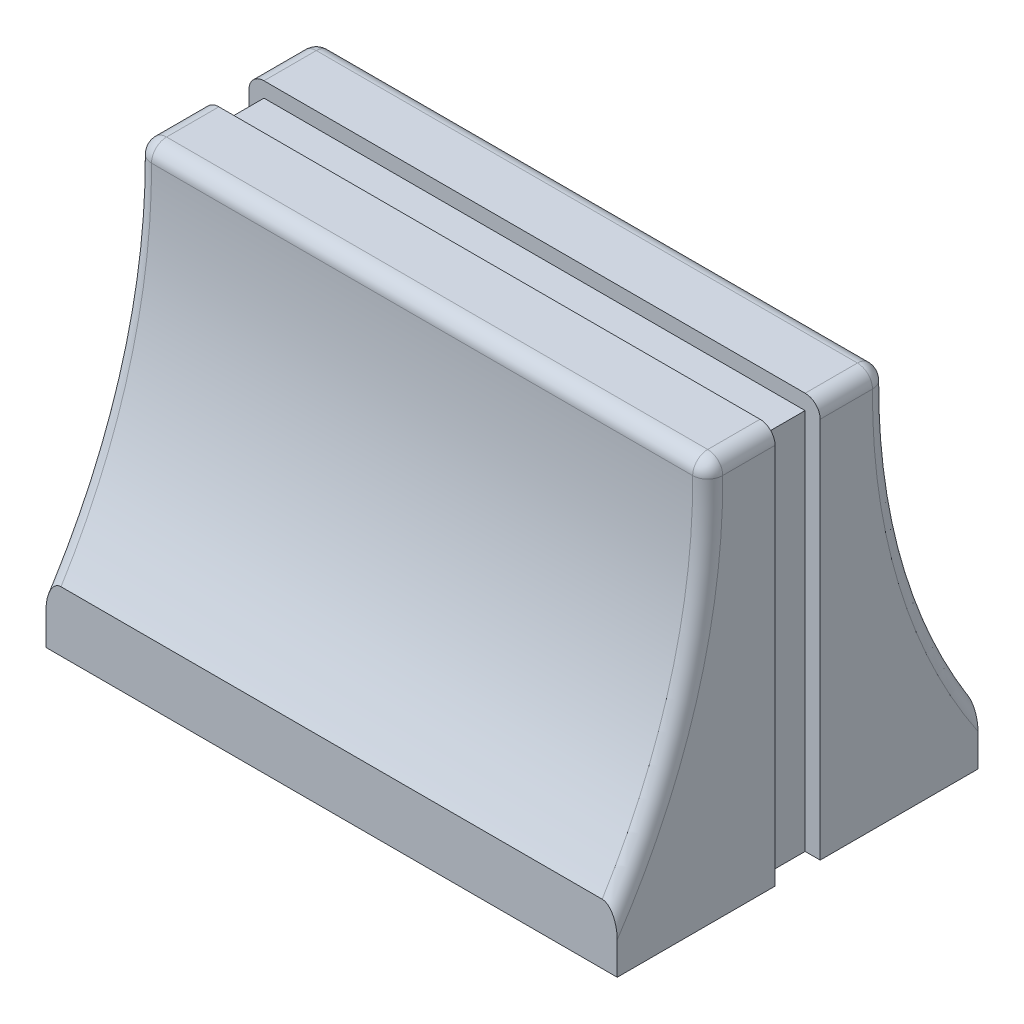
ISO-10303-21;
HEADER;
FILE_DESCRIPTION(('STEP AP214'),'2;1');
FILE_NAME('part.step','',(''),(''),'','','');
FILE_SCHEMA(('AUTOMOTIVE_DESIGN { 1 0 10303 214 1 1 1 1 }'));
ENDSEC;
DATA;
#1=APPLICATION_CONTEXT('core data for automotive mechanical design processes');
#2=APPLICATION_PROTOCOL_DEFINITION('international standard','automotive_design',2000,#1);
#3=PRODUCT_CONTEXT('',#1,'mechanical');
#4=PRODUCT('Part','Part','',(#3));
#5=PRODUCT_RELATED_PRODUCT_CATEGORY('part','',(#4));
#6=PRODUCT_DEFINITION_FORMATION('','',#4);
#7=PRODUCT_DEFINITION_CONTEXT('part definition',#1,'design');
#8=PRODUCT_DEFINITION('design','',#6,#7);
#9=PRODUCT_DEFINITION_SHAPE('','',#8);
#10=(LENGTH_UNIT() NAMED_UNIT(*) SI_UNIT(.MILLI.,.METRE.));
#11=(NAMED_UNIT(*) PLANE_ANGLE_UNIT() SI_UNIT($,.RADIAN.));
#12=(NAMED_UNIT(*) SI_UNIT($,.STERADIAN.) SOLID_ANGLE_UNIT());
#13=UNCERTAINTY_MEASURE_WITH_UNIT(LENGTH_MEASURE(1.E-05),#10,'distance_accuracy_value','');
#14=(GEOMETRIC_REPRESENTATION_CONTEXT(3) GLOBAL_UNCERTAINTY_ASSIGNED_CONTEXT((#13)) GLOBAL_UNIT_ASSIGNED_CONTEXT((#10,
#11,#12)) REPRESENTATION_CONTEXT('',''));
#15=CARTESIAN_POINT('',(0.,0.,0.));
#16=DIRECTION('',(0.,0.,1.));
#17=DIRECTION('',(1.,0.,0.));
#18=AXIS2_PLACEMENT_3D('',#15,#16,#17);
#19=CARTESIAN_POINT('',(0.,13.2,0.));
#20=DIRECTION('',(0.,1.,0.));
#21=DIRECTION('',(0.,0.,1.));
#22=AXIS2_PLACEMENT_3D('',#19,#20,#21);
#23=PLANE('',#22);
#24=DIRECTION('',(-1.,0.,0.));
#25=VECTOR('',#24,1.);
#26=CARTESIAN_POINT('',(-9.,13.2,-0.749999999999998));
#27=LINE('',#26,#25);
#28=CARTESIAN_POINT('',(9.,13.2,-0.749999999999998));
#29=VERTEX_POINT('',#28);
#30=CARTESIAN_POINT('',(-9.,13.2,-0.749999999999998));
#31=VERTEX_POINT('',#30);
#32=EDGE_CURVE('E254',#29,#31,#27,.T.);
#33=ORIENTED_EDGE('',*,*,#32,.F.);
#34=DIRECTION('',(0.,0.,-1.));
#35=VECTOR('',#34,1.);
#36=CARTESIAN_POINT('',(9.,13.2,-2.49974419867554));
#37=LINE('',#36,#35);
#38=CARTESIAN_POINT('',(9.,13.2,-2.49004773550031));
#39=VERTEX_POINT('',#38);
#40=EDGE_CURVE('E459',#29,#39,#37,.T.);
#41=ORIENTED_EDGE('',*,*,#40,.T.);
#42=DIRECTION('',(-1.,0.,0.));
#43=VECTOR('',#42,1.);
#44=CARTESIAN_POINT('',(-9.,13.2,-2.49004773550031));
#45=LINE('',#44,#43);
#46=CARTESIAN_POINT('',(-9.,13.2,-2.49004773550031));
#47=VERTEX_POINT('',#46);
#48=EDGE_CURVE('E478',#39,#47,#45,.T.);
#49=ORIENTED_EDGE('',*,*,#48,.T.);
#50=DIRECTION('',(0.,0.,1.));
#51=VECTOR('',#50,1.);
#52=CARTESIAN_POINT('',(-9.,13.2,2.49974419867554));
#53=LINE('',#52,#51);
#54=EDGE_CURVE('E462',#47,#31,#53,.T.);
#55=ORIENTED_EDGE('',*,*,#54,.T.);
#56=EDGE_LOOP('',(#33,#41,#49,#55));
#57=FACE_BOUND('',#56,.T.);
#58=ADVANCED_FACE('F38',(#57),#23,.T.);
#59=CARTESIAN_POINT('',(9.,0.,0.));
#60=DIRECTION('',(1.,0.,0.));
#61=DIRECTION('',(0.,0.,-1.));
#62=AXIS2_PLACEMENT_3D('',#59,#60,#61);
#63=PLANE('',#62);
#64=DIRECTION('',(0.,1.,0.));
#65=VECTOR('',#64,1.);
#66=CARTESIAN_POINT('',(9.,13.2,-0.749999999999998));
#67=LINE('',#66,#65);
#68=CARTESIAN_POINT('',(9.,0.,-0.749999999999999));
#69=VERTEX_POINT('',#68);
#70=CARTESIAN_POINT('',(9.,12.7,-0.749999999999998));
#71=VERTEX_POINT('',#70);
#72=EDGE_CURVE('E287',#69,#71,#67,.T.);
#73=ORIENTED_EDGE('',*,*,#72,.T.);
#74=DIRECTION('',(0.,0.,-1.));
#75=VECTOR('',#74,1.);
#76=CARTESIAN_POINT('',(9.,12.7,-0.749999999999998));
#77=LINE('',#76,#75);
#78=CARTESIAN_POINT('',(9.,12.7,0.750000000000003));
#79=VERTEX_POINT('',#78);
#80=EDGE_CURVE('E256',#79,#71,#77,.T.);
#81=ORIENTED_EDGE('',*,*,#80,.F.);
#82=DIRECTION('',(0.,-1.,0.));
#83=VECTOR('',#82,1.);
#84=CARTESIAN_POINT('',(9.,13.2,0.750000000000003));
#85=LINE('',#84,#83);
#86=CARTESIAN_POINT('',(9.,0.,0.750000000000001));
#87=VERTEX_POINT('',#86);
#88=EDGE_CURVE('E281',#79,#87,#85,.T.);
#89=ORIENTED_EDGE('',*,*,#88,.T.);
#90=DIRECTION('',(0.,0.,-1.));
#91=VECTOR('',#90,1.);
#92=CARTESIAN_POINT('',(9.,0.,0.750000000000001));
#93=LINE('',#92,#91);
#94=EDGE_CURVE('E283',#87,#69,#93,.T.);
#95=ORIENTED_EDGE('',*,*,#94,.T.);
#96=EDGE_LOOP('',(#73,#81,#89,#95));
#97=FACE_BOUND('',#96,.T.);
#98=ADVANCED_FACE('F428',(#97),#63,.T.);
#99=CARTESIAN_POINT('',(-9.,0.,0.));
#100=DIRECTION('',(-1.,0.,0.));
#101=DIRECTION('',(0.,0.,-1.));
#102=AXIS2_PLACEMENT_3D('',#99,#100,#101);
#103=PLANE('',#102);
#104=DIRECTION('',(0.,-1.,0.));
#105=VECTOR('',#104,1.);
#106=CARTESIAN_POINT('',(-9.,13.2,0.750000000000003));
#107=LINE('',#106,#105);
#108=CARTESIAN_POINT('',(-9.,12.7,0.750000000000003));
#109=VERTEX_POINT('',#108);
#110=CARTESIAN_POINT('',(-9.,0.,0.750000000000001));
#111=VERTEX_POINT('',#110);
#112=EDGE_CURVE('E262',#109,#111,#107,.T.);
#113=ORIENTED_EDGE('',*,*,#112,.F.);
#114=DIRECTION('',(0.,0.,1.));
#115=VECTOR('',#114,1.);
#116=CARTESIAN_POINT('',(-9.,12.7,-0.749999999999998));
#117=LINE('',#116,#115);
#118=CARTESIAN_POINT('',(-9.,12.7,-0.749999999999998));
#119=VERTEX_POINT('',#118);
#120=EDGE_CURVE('E251',#119,#109,#117,.T.);
#121=ORIENTED_EDGE('',*,*,#120,.F.);
#122=DIRECTION('',(0.,1.,0.));
#123=VECTOR('',#122,1.);
#124=CARTESIAN_POINT('',(-9.,13.2,-0.749999999999998));
#125=LINE('',#124,#123);
#126=CARTESIAN_POINT('',(-9.,0.,-0.749999999999999));
#127=VERTEX_POINT('',#126);
#128=EDGE_CURVE('E264',#127,#119,#125,.T.);
#129=ORIENTED_EDGE('',*,*,#128,.F.);
#130=DIRECTION('',(0.,0.,-1.));
#131=VECTOR('',#130,1.);
#132=CARTESIAN_POINT('',(-9.,0.,0.750000000000001));
#133=LINE('',#132,#131);
#134=EDGE_CURVE('E268',#111,#127,#133,.T.);
#135=ORIENTED_EDGE('',*,*,#134,.F.);
#136=EDGE_LOOP('',(#113,#121,#129,#135));
#137=FACE_BOUND('',#136,.T.);
#138=ADVANCED_FACE('F371',(#137),#103,.T.);
#139=CARTESIAN_POINT('',(-9.5,13.2,-6.));
#140=DIRECTION('',(1.,0.,0.));
#141=DIRECTION('',(0.,0.,-1.));
#142=AXIS2_PLACEMENT_3D('',#139,#140,#141);
#143=PLANE('',#142);
#144=DIRECTION('',(0.,-1.,0.));
#145=VECTOR('',#144,1.);
#146=CARTESIAN_POINT('',(-9.5,13.2,0.750000000000003));
#147=LINE('',#146,#145);
#148=CARTESIAN_POINT('',(-9.5,12.7,0.750000000000003));
#149=VERTEX_POINT('',#148);
#150=CARTESIAN_POINT('',(-9.5,0.,0.750000000000001));
#151=VERTEX_POINT('',#150);
#152=EDGE_CURVE('E259',#149,#151,#147,.T.);
#153=ORIENTED_EDGE('',*,*,#152,.T.);
#154=DIRECTION('',(0.,0.,1.));
#155=VECTOR('',#154,1.);
#156=CARTESIAN_POINT('',(-9.5,0.,-6.));
#157=LINE('',#156,#155);
#158=CARTESIAN_POINT('',(-9.49999999999999,0.,6.));
#159=VERTEX_POINT('',#158);
#160=EDGE_CURVE('E301',#151,#159,#157,.T.);
#161=ORIENTED_EDGE('',*,*,#160,.T.);
#162=DIRECTION('',(0.,-1.,0.));
#163=VECTOR('',#162,1.);
#164=CARTESIAN_POINT('',(-9.49999999999999,13.2,6.));
#165=LINE('',#164,#163);
#166=CARTESIAN_POINT('',(-9.49999999999999,1.08057053863972,6.));
#167=VERTEX_POINT('',#166);
#168=EDGE_CURVE('E326',#167,#159,#165,.T.);
#169=ORIENTED_EDGE('',*,*,#168,.F.);
#170=CARTESIAN_POINT('',(-9.49999999999999,12.5525493151339,22.9895174431667));
#171=DIRECTION('',(1.,0.,0.));
#172=DIRECTION('',(0.,0.,-1.));
#173=AXIS2_PLACEMENT_3D('',#170,#171,#172);
#174=CIRCLE('',#173,20.5);
#175=CARTESIAN_POINT('',(-9.49999999999999,12.7,2.49004773550031));
#176=VERTEX_POINT('',#175);
#177=EDGE_CURVE('E331',#167,#176,#174,.T.);
#178=ORIENTED_EDGE('',*,*,#177,.T.);
#179=DIRECTION('',(0.,0.,1.));
#180=VECTOR('',#179,1.);
#181=CARTESIAN_POINT('',(-9.5,12.7,-2.49974419867554));
#182=LINE('',#181,#180);
#183=EDGE_CURVE('E490',#176,#149,#182,.F.);
#184=ORIENTED_EDGE('',*,*,#183,.T.);
#185=EDGE_LOOP('',(#153,#161,#169,#178,#184));
#186=FACE_BOUND('',#185,.T.);
#187=ADVANCED_FACE('F367',(#186),#143,.F.);
#188=DIRECTION('',(0.,1.,0.));
#189=VECTOR('',#188,1.);
#190=CARTESIAN_POINT('',(-9.5,13.2,-0.749999999999998));
#191=LINE('',#190,#189);
#192=CARTESIAN_POINT('',(-9.5,0.,-0.749999999999999));
#193=VERTEX_POINT('',#192);
#194=CARTESIAN_POINT('',(-9.5,12.7,-0.749999999999998));
#195=VERTEX_POINT('',#194);
#196=EDGE_CURVE('E265',#193,#195,#191,.T.);
#197=ORIENTED_EDGE('',*,*,#196,.T.);
#198=CARTESIAN_POINT('',(-9.5,12.7,-2.49004773550031));
#199=VERTEX_POINT('',#198);
#200=EDGE_CURVE('E489',#195,#199,#182,.F.);
#201=ORIENTED_EDGE('',*,*,#200,.T.);
#202=CARTESIAN_POINT('',(-9.5,12.5525493151339,-22.9895174431667));
#203=DIRECTION('',(1.,0.,0.));
#204=DIRECTION('',(0.,0.,-1.));
#205=AXIS2_PLACEMENT_3D('',#202,#203,#204);
#206=CIRCLE('',#205,20.5);
#207=CARTESIAN_POINT('',(-9.5,1.08057053863972,-6.));
#208=VERTEX_POINT('',#207);
#209=EDGE_CURVE('E329',#199,#208,#206,.T.);
#210=ORIENTED_EDGE('',*,*,#209,.T.);
#211=DIRECTION('',(0.,-1.,0.));
#212=VECTOR('',#211,1.);
#213=CARTESIAN_POINT('',(-9.5,13.2,-6.));
#214=LINE('',#213,#212);
#215=CARTESIAN_POINT('',(-9.5,0.,-6.));
#216=VERTEX_POINT('',#215);
#217=EDGE_CURVE('E319',#208,#216,#214,.T.);
#218=ORIENTED_EDGE('',*,*,#217,.T.);
#219=EDGE_CURVE('E306',#216,#193,#157,.T.);
#220=ORIENTED_EDGE('',*,*,#219,.T.);
#221=EDGE_LOOP('',(#197,#201,#210,#218,#220));
#222=FACE_BOUND('',#221,.T.);
#223=ADVANCED_FACE('F370',(#222),#143,.F.);
#224=CARTESIAN_POINT('',(0.,0.,0.));
#225=DIRECTION('',(0.,1.,0.));
#226=DIRECTION('',(0.,0.,1.));
#227=AXIS2_PLACEMENT_3D('',#224,#225,#226);
#228=PLANE('',#227);
#229=DIRECTION('',(1.,0.,0.));
#230=VECTOR('',#229,1.);
#231=CARTESIAN_POINT('',(-0.6,0.,-2.));
#232=LINE('',#231,#230);
#233=CARTESIAN_POINT('',(-0.6,0.,-2.));
#234=VERTEX_POINT('',#233);
#235=CARTESIAN_POINT('',(0.6,0.,-2.));
#236=VERTEX_POINT('',#235);
#237=EDGE_CURVE('E241',#234,#236,#232,.T.);
#238=ORIENTED_EDGE('',*,*,#237,.F.);
#239=DIRECTION('',(0.,0.,-1.));
#240=VECTOR('',#239,1.);
#241=CARTESIAN_POINT('',(-0.600000000000001,0.,2.));
#242=LINE('',#241,#240);
#243=CARTESIAN_POINT('',(-0.600000000000001,0.,2.));
#244=VERTEX_POINT('',#243);
#245=EDGE_CURVE('E53',#244,#234,#242,.T.);
#246=ORIENTED_EDGE('',*,*,#245,.F.);
#247=DIRECTION('',(-1.,0.,0.));
#248=VECTOR('',#247,1.);
#249=CARTESIAN_POINT('',(-0.600000000000001,0.,2.));
#250=LINE('',#249,#248);
#251=CARTESIAN_POINT('',(0.599999999999999,0.,2.));
#252=VERTEX_POINT('',#251);
#253=EDGE_CURVE('E232',#252,#244,#250,.T.);
#254=ORIENTED_EDGE('',*,*,#253,.F.);
#255=DIRECTION('',(0.,0.,1.));
#256=VECTOR('',#255,1.);
#257=CARTESIAN_POINT('',(0.599999999999999,0.,2.));
#258=LINE('',#257,#256);
#259=EDGE_CURVE('E235',#236,#252,#258,.T.);
#260=ORIENTED_EDGE('',*,*,#259,.F.);
#261=EDGE_LOOP('',(#238,#246,#254,#260));
#262=FACE_BOUND('',#261,.T.);
#263=DIRECTION('',(-1.,0.,0.));
#264=VECTOR('',#263,1.);
#265=CARTESIAN_POINT('',(-9.,0.,0.750000000000001));
#266=LINE('',#265,#264);
#267=EDGE_CURVE('E276',#111,#151,#266,.T.);
#268=ORIENTED_EDGE('',*,*,#267,.F.);
#269=ORIENTED_EDGE('',*,*,#134,.T.);
#270=DIRECTION('',(-1.,0.,0.));
#271=VECTOR('',#270,1.);
#272=CARTESIAN_POINT('',(-9.,0.,-0.749999999999999));
#273=LINE('',#272,#271);
#274=EDGE_CURVE('E271',#127,#193,#273,.T.);
#275=ORIENTED_EDGE('',*,*,#274,.T.);
#276=ORIENTED_EDGE('',*,*,#219,.F.);
#277=DIRECTION('',(-1.,0.,0.));
#278=VECTOR('',#277,1.);
#279=CARTESIAN_POINT('',(-9.5,0.,-6.));
#280=LINE('',#279,#278);
#281=CARTESIAN_POINT('',(9.5,0.,-6.));
#282=VERTEX_POINT('',#281);
#283=EDGE_CURVE('E316',#282,#216,#280,.T.);
#284=ORIENTED_EDGE('',*,*,#283,.F.);
#285=DIRECTION('',(0.,0.,-1.));
#286=VECTOR('',#285,1.);
#287=CARTESIAN_POINT('',(9.5,0.,-6.));
#288=LINE('',#287,#286);
#289=CARTESIAN_POINT('',(9.5,0.,-0.749999999999999));
#290=VERTEX_POINT('',#289);
#291=EDGE_CURVE('E312',#290,#282,#288,.T.);
#292=ORIENTED_EDGE('',*,*,#291,.F.);
#293=DIRECTION('',(1.,0.,0.));
#294=VECTOR('',#293,1.);
#295=CARTESIAN_POINT('',(9.,0.,-0.749999999999999));
#296=LINE('',#295,#294);
#297=EDGE_CURVE('E293',#69,#290,#296,.T.);
#298=ORIENTED_EDGE('',*,*,#297,.F.);
#299=ORIENTED_EDGE('',*,*,#94,.F.);
#300=DIRECTION('',(1.,0.,0.));
#301=VECTOR('',#300,1.);
#302=CARTESIAN_POINT('',(9.,0.,0.750000000000001));
#303=LINE('',#302,#301);
#304=CARTESIAN_POINT('',(9.5,0.,0.750000000000001));
#305=VERTEX_POINT('',#304);
#306=EDGE_CURVE('E290',#87,#305,#303,.T.);
#307=ORIENTED_EDGE('',*,*,#306,.T.);
#308=CARTESIAN_POINT('',(9.5,0.,6.));
#309=VERTEX_POINT('',#308);
#310=EDGE_CURVE('E313',#309,#305,#288,.T.);
#311=ORIENTED_EDGE('',*,*,#310,.F.);
#312=DIRECTION('',(1.,0.,0.));
#313=VECTOR('',#312,1.);
#314=CARTESIAN_POINT('',(-9.49999999999999,0.,6.));
#315=LINE('',#314,#313);
#316=EDGE_CURVE('E309',#159,#309,#315,.T.);
#317=ORIENTED_EDGE('',*,*,#316,.F.);
#318=ORIENTED_EDGE('',*,*,#160,.F.);
#319=EDGE_LOOP('',(#268,#269,#275,#276,#284,#292,#298,#299,#307,#311,#317,#318));
#320=FACE_BOUND('',#319,.T.);
#321=ADVANCED_FACE('F402',(#262,#320),#228,.F.);
#322=CARTESIAN_POINT('',(-9.,12.7,0.));
#323=DIRECTION('',(0.,0.,-1.));
#324=DIRECTION('',(-1.,0.,0.));
#325=AXIS2_PLACEMENT_3D('',#322,#323,#324);
#326=CYLINDRICAL_SURFACE('',#325,0.5);
#327=CARTESIAN_POINT('',(-9.,13.2,0.750000000000003));
#328=VERTEX_POINT('',#327);
#329=CARTESIAN_POINT('',(-8.99999999999999,13.2,2.49004773550031));
#330=VERTEX_POINT('',#329);
#331=EDGE_CURVE('E487',#328,#330,#53,.T.);
#332=ORIENTED_EDGE('',*,*,#331,.F.);
#333=CARTESIAN_POINT('',(-9.,12.7,0.750000000000002));
#334=DIRECTION('',(0.,0.,-1.));
#335=DIRECTION('',(-1.,0.,0.));
#336=AXIS2_PLACEMENT_3D('',#333,#334,#335);
#337=CIRCLE('',#336,0.5);
#338=EDGE_CURVE('E12',#328,#149,#337,.F.);
#339=ORIENTED_EDGE('',*,*,#338,.T.);
#340=ORIENTED_EDGE('',*,*,#183,.F.);
#341=CARTESIAN_POINT('',(-8.99999999999999,12.7,2.49004773550031));
#342=DIRECTION('',(0.,0.,-1.));
#343=DIRECTION('',(-1.,0.,0.));
#344=AXIS2_PLACEMENT_3D('',#341,#342,#343);
#345=CIRCLE('',#344,0.5);
#346=EDGE_CURVE('E509',#176,#330,#345,.T.);
#347=ORIENTED_EDGE('',*,*,#346,.T.);
#348=EDGE_LOOP('',(#332,#339,#340,#347));
#349=FACE_BOUND('',#348,.T.);
#350=ADVANCED_FACE('F406',(#349),#326,.T.);
#351=ORIENTED_EDGE('',*,*,#200,.F.);
#352=CARTESIAN_POINT('',(-9.,12.7,-0.749999999999998));
#353=DIRECTION('',(0.,0.,1.));
#354=DIRECTION('',(1.,0.,0.));
#355=AXIS2_PLACEMENT_3D('',#352,#353,#354);
#356=CIRCLE('',#355,0.5);
#357=EDGE_CURVE('E46',#195,#31,#356,.F.);
#358=ORIENTED_EDGE('',*,*,#357,.T.);
#359=ORIENTED_EDGE('',*,*,#54,.F.);
#360=CARTESIAN_POINT('',(-9.,12.7,-2.49004773550031));
#361=DIRECTION('',(0.,0.,-1.));
#362=DIRECTION('',(-1.,0.,0.));
#363=AXIS2_PLACEMENT_3D('',#360,#361,#362);
#364=CIRCLE('',#363,0.5);
#365=EDGE_CURVE('E295',#199,#47,#364,.T.);
#366=ORIENTED_EDGE('',*,*,#365,.F.);
#367=EDGE_LOOP('',(#351,#358,#359,#366));
#368=FACE_BOUND('',#367,.T.);
#369=ADVANCED_FACE('F526',(#368),#326,.T.);
#370=CARTESIAN_POINT('',(9.5,13.2,-6.));
#371=DIRECTION('',(-1.,0.,0.));
#372=DIRECTION('',(0.,0.,1.));
#373=AXIS2_PLACEMENT_3D('',#370,#371,#372);
#374=PLANE('',#373);
#375=ORIENTED_EDGE('',*,*,#310,.T.);
#376=DIRECTION('',(0.,-1.,0.));
#377=VECTOR('',#376,1.);
#378=CARTESIAN_POINT('',(9.5,13.2,0.750000000000003));
#379=LINE('',#378,#377);
#380=CARTESIAN_POINT('',(9.5,12.7,0.750000000000003));
#381=VERTEX_POINT('',#380);
#382=EDGE_CURVE('E278',#381,#305,#379,.T.);
#383=ORIENTED_EDGE('',*,*,#382,.F.);
#384=DIRECTION('',(0.,0.,-1.));
#385=VECTOR('',#384,1.);
#386=CARTESIAN_POINT('',(9.5,12.7,2.49974419867554));
#387=LINE('',#386,#385);
#388=CARTESIAN_POINT('',(9.5,12.7,2.49004773550031));
#389=VERTEX_POINT('',#388);
#390=EDGE_CURVE('E499',#381,#389,#387,.F.);
#391=ORIENTED_EDGE('',*,*,#390,.T.);
#392=CARTESIAN_POINT('',(9.5,12.5525493151339,22.9895174431667));
#393=DIRECTION('',(-1.,0.,0.));
#394=DIRECTION('',(0.,0.,1.));
#395=AXIS2_PLACEMENT_3D('',#392,#393,#394);
#396=CIRCLE('',#395,20.5);
#397=CARTESIAN_POINT('',(9.5,1.08057053863972,6.));
#398=VERTEX_POINT('',#397);
#399=EDGE_CURVE('E564',#389,#398,#396,.T.);
#400=ORIENTED_EDGE('',*,*,#399,.T.);
#401=DIRECTION('',(0.,-1.,0.));
#402=VECTOR('',#401,1.);
#403=CARTESIAN_POINT('',(9.5,13.2,6.));
#404=LINE('',#403,#402);
#405=EDGE_CURVE('E324',#398,#309,#404,.T.);
#406=ORIENTED_EDGE('',*,*,#405,.T.);
#407=EDGE_LOOP('',(#375,#383,#391,#400,#406));
#408=FACE_BOUND('',#407,.T.);
#409=ADVANCED_FACE('F608',(#408),#374,.F.);
#410=CARTESIAN_POINT('',(9.,12.7,0.));
#411=DIRECTION('',(0.,0.,1.));
#412=DIRECTION('',(1.,0.,0.));
#413=AXIS2_PLACEMENT_3D('',#410,#411,#412);
#414=CYLINDRICAL_SURFACE('',#413,0.5);
#415=CARTESIAN_POINT('',(9.,12.7,0.750000000000002));
#416=DIRECTION('',(0.,0.,1.));
#417=DIRECTION('',(1.,0.,0.));
#418=AXIS2_PLACEMENT_3D('',#415,#416,#417);
#419=CIRCLE('',#418,0.5);
#420=CARTESIAN_POINT('',(9.,13.2,0.750000000000003));
#421=VERTEX_POINT('',#420);
#422=EDGE_CURVE('E470',#421,#381,#419,.F.);
#423=ORIENTED_EDGE('',*,*,#422,.F.);
#424=CARTESIAN_POINT('',(9.,13.2,2.49004773550031));
#425=VERTEX_POINT('',#424);
#426=EDGE_CURVE('E477',#425,#421,#37,.T.);
#427=ORIENTED_EDGE('',*,*,#426,.F.);
#428=CARTESIAN_POINT('',(9.,12.7,2.49004773550031));
#429=DIRECTION('',(0.,0.,-1.));
#430=DIRECTION('',(-1.,0.,0.));
#431=AXIS2_PLACEMENT_3D('',#428,#429,#430);
#432=CIRCLE('',#431,0.5);
#433=EDGE_CURVE('E305',#425,#389,#432,.T.);
#434=ORIENTED_EDGE('',*,*,#433,.T.);
#435=ORIENTED_EDGE('',*,*,#390,.F.);
#436=EDGE_LOOP('',(#423,#427,#434,#435));
#437=FACE_BOUND('',#436,.T.);
#438=ADVANCED_FACE('F364',(#437),#414,.T.);
#439=CARTESIAN_POINT('',(-9.49999999999999,13.2,6.));
#440=DIRECTION('',(0.,0.,-1.));
#441=DIRECTION('',(-1.,0.,0.));
#442=AXIS2_PLACEMENT_3D('',#439,#440,#441);
#443=PLANE('',#442);
#444=DIRECTION('',(1.,0.,0.));
#445=VECTOR('',#444,1.);
#446=CARTESIAN_POINT('',(-9.5,2.,6.));
#447=LINE('',#446,#445);
#448=CARTESIAN_POINT('',(-8.99999999999999,2.,6.));
#449=VERTEX_POINT('',#448);
#450=CARTESIAN_POINT('',(9.,2.,6.));
#451=VERTEX_POINT('',#450);
#452=EDGE_CURVE('E298',#449,#451,#447,.T.);
#453=ORIENTED_EDGE('',*,*,#452,.F.);
#454=CARTESIAN_POINT('',(-8.99999999999999,2.,6.));
#455=CARTESIAN_POINT('',(-9.01593482302451,2.00003871720708,6.));
#456=CARTESIAN_POINT('',(-9.03182076423664,1.99855824881693,6.));
#457=CARTESIAN_POINT('',(-9.0629462742917,1.99291339268454,6.));
#458=CARTESIAN_POINT('',(-9.07819082029021,1.98877684774225,6.));
#459=CARTESIAN_POINT('',(-9.11122628783801,1.97694488701544,6.));
#460=CARTESIAN_POINT('',(-9.1287999363865,1.96865105694519,6.));
#461=CARTESIAN_POINT('',(-9.16241544233711,1.94931787298692,6.));
#462=CARTESIAN_POINT('',(-9.17845042513103,1.93826692555907,6.));
#463=CARTESIAN_POINT('',(-9.21685114619622,1.90784658726374,6.));
#464=CARTESIAN_POINT('',(-9.2381535033216,1.88714579172202,6.));
#465=CARTESIAN_POINT('',(-9.27739154351195,1.84281124382757,6.));
#466=CARTESIAN_POINT('',(-9.29532064784262,1.81917190656682,6.));
#467=CARTESIAN_POINT('',(-9.34079952469419,1.75137744611287,6.));
#468=CARTESIAN_POINT('',(-9.36536353045615,1.70523345409332,6.));
#469=CARTESIAN_POINT('',(-9.40763451848517,1.60981755503118,6.));
#470=CARTESIAN_POINT('',(-9.42530927786083,1.56053217463863,6.));
#471=CARTESIAN_POINT('',(-9.45035867736002,1.47530779691053,6.));
#472=CARTESIAN_POINT('',(-9.45923267781526,1.43979772495806,6.));
#473=CARTESIAN_POINT('',(-9.47431638559779,1.36819787469566,6.));
#474=CARTESIAN_POINT('',(-9.48052463745191,1.33210779083177,6.));
#475=CARTESIAN_POINT('',(-9.49032263445167,1.26016523398803,6.));
#476=CARTESIAN_POINT('',(-9.49395264416685,1.22431818230116,6.));
#477=CARTESIAN_POINT('',(-9.49878421822874,1.15250354665809,6.));
#478=CARTESIAN_POINT('',(-9.4999886932702,1.11653615911299,6.));
#479=CARTESIAN_POINT('',(-9.49999999999999,1.08057053863972,6.));
#480=B_SPLINE_CURVE_WITH_KNOTS('',3,(#454,#455,#456,#457,#458,#459,#460,#461,#462,#463,#464,
#465,#466,#467,#468,#469,#470,#471,#472,#473,#474,#475,#476,#477,#478,#479),.UNSPECIFIED.,.F.,
.F.,(4,2,2,2,2,2,2,2,2,2,2,2,4),(0.,0.0476566754778504,0.0948217609162696,0.152797785051734,
0.211021830113081,0.299631885661653,0.388413002402445,0.544372827562173,0.701053608468308,
0.810757633176087,0.920521479301077,1.02853101913935,1.13641086774047),.UNSPECIFIED.);
#481=EDGE_CURVE('E347',#449,#167,#480,.T.);
#482=ORIENTED_EDGE('',*,*,#481,.T.);
#483=ORIENTED_EDGE('',*,*,#168,.T.);
#484=ORIENTED_EDGE('',*,*,#316,.T.);
#485=ORIENTED_EDGE('',*,*,#405,.F.);
#486=CARTESIAN_POINT('',(9.5,1.08057053863972,6.));
#487=CARTESIAN_POINT('',(9.49997784964862,1.12284524758468,6.));
#488=CARTESIAN_POINT('',(9.49831954528324,1.16512748919414,6.));
#489=CARTESIAN_POINT('',(9.49164203179923,1.24954277134469,6.));
#490=CARTESIAN_POINT('',(9.48661348959164,1.29167507003577,6.));
#491=CARTESIAN_POINT('',(9.47307984992766,1.37555073846866,6.));
#492=CARTESIAN_POINT('',(9.46456130729899,1.41729195825527,6.));
#493=CARTESIAN_POINT('',(9.44379479439874,1.49979463765884,6.));
#494=CARTESIAN_POINT('',(9.4315520774166,1.54055739066571,6.));
#495=CARTESIAN_POINT('',(9.40657272515382,1.61026598779349,6.));
#496=CARTESIAN_POINT('',(9.39477747611463,1.63954857310457,6.));
#497=CARTESIAN_POINT('',(9.36857520202708,1.69694972559418,6.));
#498=CARTESIAN_POINT('',(9.35416757661997,1.72506802337559,6.));
#499=CARTESIAN_POINT('',(9.32221665197499,1.77978349635336,6.));
#500=CARTESIAN_POINT('',(9.30464966436812,1.80636702420808,6.));
#501=CARTESIAN_POINT('',(9.26592035029105,1.85678153261598,6.));
#502=CARTESIAN_POINT('',(9.24476716194308,1.88061925682223,6.));
#503=CARTESIAN_POINT('',(9.20781364443664,1.9149986516405,6.));
#504=CARTESIAN_POINT('',(9.19336708288268,1.92698844070163,6.));
#505=CARTESIAN_POINT('',(9.16293719780712,1.94888747580942,6.));
#506=CARTESIAN_POINT('',(9.14695345360653,1.95879614994408,6.));
#507=CARTESIAN_POINT('',(9.11331781955804,1.97595691230078,6.));
#508=CARTESIAN_POINT('',(9.09564638224163,1.98317147125136,6.));
#509=CARTESIAN_POINT('',(9.05924478497202,1.99396441851136,6.));
#510=CARTESIAN_POINT('',(9.04051912011496,1.99755716884697,6.));
#511=CARTESIAN_POINT('',(9.01806183791321,1.99940678046478,6.));
#512=CARTESIAN_POINT('',(9.0144521507501,1.99962909742375,6.));
#513=CARTESIAN_POINT('',(9.00722879333585,1.99992540373606,6.));
#514=CARTESIAN_POINT('',(9.00361512663229,1.99999947946263,6.));
#515=CARTESIAN_POINT('',(9.,2.,6.));
#516=B_SPLINE_CURVE_WITH_KNOTS('',3,(#486,#487,#488,#489,#490,#491,#492,#493,#494,#495,#496,
#497,#498,#499,#500,#501,#502,#503,#504,#505,#506,#507,#508,#509,#510,#511,#512,#513,#514,#515),
.UNSPECIFIED.,.F.,.F.,(4,2,2,2,2,2,2,2,2,2,2,2,2,2,4),(0.,0.126805178961423,0.253962974300234,
0.381615319679316,0.509088428202508,0.603691612512869,0.698316565509865,0.79368306138494,
0.888810105856767,0.944993911383706,1.00119313665969,1.05814835085162,1.11487681408461,
1.12572484343123,1.13656655029772),.UNSPECIFIED.);
#517=EDGE_CURVE('E339',#398,#451,#516,.T.);
#518=ORIENTED_EDGE('',*,*,#517,.T.);
#519=EDGE_LOOP('',(#453,#482,#483,#484,#485,#518));
#520=FACE_BOUND('',#519,.T.);
#521=ADVANCED_FACE('F358',(#520),#443,.F.);
#522=CARTESIAN_POINT('',(9.5,12.7,-2.49004773550031));
#523=VERTEX_POINT('',#522);
#524=CARTESIAN_POINT('',(9.5,12.7,-0.749999999999998));
#525=VERTEX_POINT('',#524);
#526=EDGE_CURVE('E500',#523,#525,#387,.F.);
#527=ORIENTED_EDGE('',*,*,#526,.T.);
#528=DIRECTION('',(0.,1.,0.));
#529=VECTOR('',#528,1.);
#530=CARTESIAN_POINT('',(9.5,13.2,-0.749999999999998));
#531=LINE('',#530,#529);
#532=EDGE_CURVE('E284',#290,#525,#531,.T.);
#533=ORIENTED_EDGE('',*,*,#532,.F.);
#534=ORIENTED_EDGE('',*,*,#291,.T.);
#535=DIRECTION('',(0.,-1.,0.));
#536=VECTOR('',#535,1.);
#537=CARTESIAN_POINT('',(9.5,13.2,-6.));
#538=LINE('',#537,#536);
#539=CARTESIAN_POINT('',(9.5,1.08057053863972,-6.));
#540=VERTEX_POINT('',#539);
#541=EDGE_CURVE('E321',#540,#282,#538,.T.);
#542=ORIENTED_EDGE('',*,*,#541,.F.);
#543=CARTESIAN_POINT('',(9.5,12.5525493151339,-22.9895174431667));
#544=DIRECTION('',(-1.,0.,0.));
#545=DIRECTION('',(0.,0.,1.));
#546=AXIS2_PLACEMENT_3D('',#543,#544,#545);
#547=CIRCLE('',#546,20.5);
#548=EDGE_CURVE('E551',#540,#523,#547,.T.);
#549=ORIENTED_EDGE('',*,*,#548,.T.);
#550=EDGE_LOOP('',(#527,#533,#534,#542,#549));
#551=FACE_BOUND('',#550,.T.);
#552=ADVANCED_FACE('F363',(#551),#374,.F.);
#553=CARTESIAN_POINT('',(-9.5,13.2,-6.));
#554=DIRECTION('',(0.,0.,1.));
#555=DIRECTION('',(1.,0.,0.));
#556=AXIS2_PLACEMENT_3D('',#553,#554,#555);
#557=PLANE('',#556);
#558=ORIENTED_EDGE('',*,*,#217,.F.);
#559=CARTESIAN_POINT('',(-9.5,1.08057053863972,-6.));
#560=CARTESIAN_POINT('',(-9.49997784964862,1.12284524758467,-6.));
#561=CARTESIAN_POINT('',(-9.49831954528324,1.16512748919413,-6.));
#562=CARTESIAN_POINT('',(-9.49164203179922,1.24954277134468,-6.));
#563=CARTESIAN_POINT('',(-9.48661348959164,1.29167507003577,-6.));
#564=CARTESIAN_POINT('',(-9.47307984992766,1.37555073846865,-6.));
#565=CARTESIAN_POINT('',(-9.46456130729899,1.41729195825526,-6.));
#566=CARTESIAN_POINT('',(-9.44379479439874,1.49979463765883,-6.));
#567=CARTESIAN_POINT('',(-9.4315520774166,1.5405573906657,-6.));
#568=CARTESIAN_POINT('',(-9.40657272515382,1.61026598779348,-6.));
#569=CARTESIAN_POINT('',(-9.39477747611463,1.63954857310456,-6.));
#570=CARTESIAN_POINT('',(-9.36857520202708,1.69694972559417,-6.));
#571=CARTESIAN_POINT('',(-9.35416757661997,1.72506802337557,-6.));
#572=CARTESIAN_POINT('',(-9.32221665197499,1.77978349635334,-6.));
#573=CARTESIAN_POINT('',(-9.30464966436812,1.80636702420806,-6.));
#574=CARTESIAN_POINT('',(-9.26592035029106,1.85678153261597,-6.));
#575=CARTESIAN_POINT('',(-9.24476716194309,1.88061925682222,-6.));
#576=CARTESIAN_POINT('',(-9.20781364443666,1.91499865164048,-6.));
#577=CARTESIAN_POINT('',(-9.19336708288269,1.92698844070161,-6.));
#578=CARTESIAN_POINT('',(-9.16293719780713,1.9488874758094,-6.));
#579=CARTESIAN_POINT('',(-9.14695345360654,1.95879614994407,-6.));
#580=CARTESIAN_POINT('',(-9.11331781955805,1.97595691230077,-6.));
#581=CARTESIAN_POINT('',(-9.09564638224165,1.98317147125136,-6.));
#582=CARTESIAN_POINT('',(-9.05924478497204,1.99396441851136,-6.));
#583=CARTESIAN_POINT('',(-9.04051912011498,1.99755716884696,-6.));
#584=CARTESIAN_POINT('',(-9.01806183791322,1.99940678046478,-6.));
#585=CARTESIAN_POINT('',(-9.01445215075011,1.99962909742374,-6.));
#586=CARTESIAN_POINT('',(-9.00722879333586,1.99992540373606,-6.));
#587=CARTESIAN_POINT('',(-9.00361512663229,1.99999947946262,-6.));
#588=CARTESIAN_POINT('',(-9.,1.99999999999999,-6.));
#589=B_SPLINE_CURVE_WITH_KNOTS('',3,(#559,#560,#561,#562,#563,#564,#565,#566,#567,#568,#569,
#570,#571,#572,#573,#574,#575,#576,#577,#578,#579,#580,#581,#582,#583,#584,#585,#586,#587,#588),
.UNSPECIFIED.,.F.,.F.,(4,2,2,2,2,2,2,2,2,2,2,2,2,2,4),(0.,0.126805178961424,0.253962974300238,
0.381615319679317,0.509088428202508,0.603691612512864,0.698316565509856,0.793683061384928,
0.888810105856749,0.944993911383687,1.00119313665968,1.0581483508516,1.11487681408459,
1.12572484343123,1.13656655029773),.UNSPECIFIED.);
#590=CARTESIAN_POINT('',(-9.,2.,-6.));
#591=VERTEX_POINT('',#590);
#592=EDGE_CURVE('E383',#208,#591,#589,.T.);
#593=ORIENTED_EDGE('',*,*,#592,.T.);
#594=DIRECTION('',(1.,0.,0.));
#595=VECTOR('',#594,1.);
#596=CARTESIAN_POINT('',(-9.5,2.,-6.));
#597=LINE('',#596,#595);
#598=CARTESIAN_POINT('',(9.00000000000001,2.,-6.));
#599=VERTEX_POINT('',#598);
#600=EDGE_CURVE('E302',#591,#599,#597,.T.);
#601=ORIENTED_EDGE('',*,*,#600,.T.);
#602=CARTESIAN_POINT('',(9.,2.,-6.));
#603=CARTESIAN_POINT('',(9.01593482302452,2.00003871720708,-6.));
#604=CARTESIAN_POINT('',(9.03182076423665,1.99855824881694,-6.));
#605=CARTESIAN_POINT('',(9.06294627429171,1.99291339268454,-6.));
#606=CARTESIAN_POINT('',(9.07819082029022,1.98877684774224,-6.));
#607=CARTESIAN_POINT('',(9.11122628783802,1.97694488701543,-6.));
#608=CARTESIAN_POINT('',(9.12879993638652,1.96865105694519,-6.));
#609=CARTESIAN_POINT('',(9.16241544233712,1.94931787298693,-6.));
#610=CARTESIAN_POINT('',(9.17845042513104,1.93826692555906,-6.));
#611=CARTESIAN_POINT('',(9.21685114619622,1.90784658726373,-6.));
#612=CARTESIAN_POINT('',(9.23815350332161,1.88714579172201,-6.));
#613=CARTESIAN_POINT('',(9.27739154351196,1.84281124382757,-6.));
#614=CARTESIAN_POINT('',(9.29532064784263,1.81917190656682,-6.));
#615=CARTESIAN_POINT('',(9.34079952469419,1.75137744611287,-6.));
#616=CARTESIAN_POINT('',(9.36536353045615,1.70523345409332,-6.));
#617=CARTESIAN_POINT('',(9.40763451848518,1.60981755503118,-6.));
#618=CARTESIAN_POINT('',(9.42530927786084,1.56053217463863,-6.));
#619=CARTESIAN_POINT('',(9.45035867736003,1.47530779691053,-6.));
#620=CARTESIAN_POINT('',(9.45923267781527,1.43979772495806,-6.));
#621=CARTESIAN_POINT('',(9.4743163855978,1.36819787469566,-6.));
#622=CARTESIAN_POINT('',(9.48052463745191,1.33210779083177,-6.));
#623=CARTESIAN_POINT('',(9.49032263445168,1.26016523398802,-6.));
#624=CARTESIAN_POINT('',(9.49395264416686,1.22431818230115,-6.));
#625=CARTESIAN_POINT('',(9.49878421822875,1.15250354665808,-6.));
#626=CARTESIAN_POINT('',(9.4999886932702,1.11653615911298,-6.));
#627=CARTESIAN_POINT('',(9.5,1.08057053863972,-6.));
#628=B_SPLINE_CURVE_WITH_KNOTS('',3,(#602,#603,#604,#605,#606,#607,#608,#609,#610,#611,#612,
#613,#614,#615,#616,#617,#618,#619,#620,#621,#622,#623,#624,#625,#626,#627),.UNSPECIFIED.,.F.,
.F.,(4,2,2,2,2,2,2,2,2,2,2,2,4),(0.,0.0476566754778521,0.0948217609162711,0.152797785051736,
0.211021830113086,0.299631885661655,0.388413002402446,0.544372827562174,0.701053608468308,
0.810757633176087,0.920521479301081,1.02853101913935,1.13641086774047),.UNSPECIFIED.);
#629=EDGE_CURVE('E390',#599,#540,#628,.T.);
#630=ORIENTED_EDGE('',*,*,#629,.T.);
#631=ORIENTED_EDGE('',*,*,#541,.T.);
#632=ORIENTED_EDGE('',*,*,#283,.T.);
#633=EDGE_LOOP('',(#558,#593,#601,#630,#631,#632));
#634=FACE_BOUND('',#633,.T.);
#635=ADVANCED_FACE('F396',(#634),#557,.F.);
#636=DIRECTION('',(1.,0.,0.));
#637=VECTOR('',#636,1.);
#638=CARTESIAN_POINT('',(-9.,13.2,0.750000000000003));
#639=LINE('',#638,#637);
#640=EDGE_CURVE('E247',#328,#421,#639,.T.);
#641=ORIENTED_EDGE('',*,*,#640,.F.);
#642=ORIENTED_EDGE('',*,*,#331,.T.);
#643=DIRECTION('',(-1.,0.,0.));
#644=VECTOR('',#643,1.);
#645=CARTESIAN_POINT('',(9.,13.2,2.49004773550031));
#646=LINE('',#645,#644);
#647=EDGE_CURVE('E481',#330,#425,#646,.F.);
#648=ORIENTED_EDGE('',*,*,#647,.T.);
#649=ORIENTED_EDGE('',*,*,#426,.T.);
#650=EDGE_LOOP('',(#641,#642,#648,#649));
#651=FACE_BOUND('',#650,.T.);
#652=ADVANCED_FACE('F400',(#651),#23,.T.);
#653=CARTESIAN_POINT('',(-9.5,12.5525493151339,-22.9895174431667));
#654=DIRECTION('',(1.,0.,0.));
#655=DIRECTION('',(0.,0.,-1.));
#656=AXIS2_PLACEMENT_3D('',#653,#654,#655);
#657=CYLINDRICAL_SURFACE('',#656,20.);
#658=CARTESIAN_POINT('',(-9.,12.5525493151339,-22.9895174431667));
#659=DIRECTION('',(1.,0.,0.));
#660=DIRECTION('',(0.,0.,-1.));
#661=AXIS2_PLACEMENT_3D('',#658,#659,#660);
#662=CIRCLE('',#661,20.);
#663=CARTESIAN_POINT('',(-9.,12.6964036418325,-2.99003480154095));
#664=VERTEX_POINT('',#663);
#665=EDGE_CURVE('E567',#591,#664,#662,.F.);
#666=ORIENTED_EDGE('',*,*,#665,.T.);
#667=DIRECTION('',(1.,0.,0.));
#668=VECTOR('',#667,1.);
#669=CARTESIAN_POINT('',(-9.5,12.6964036418325,-2.99003480154095));
#670=LINE('',#669,#668);
#671=CARTESIAN_POINT('',(9.00000000000001,12.6964036418325,-2.99003480154096));
#672=VERTEX_POINT('',#671);
#673=EDGE_CURVE('E471',#664,#672,#670,.T.);
#674=ORIENTED_EDGE('',*,*,#673,.T.);
#675=CARTESIAN_POINT('',(9.00000000000001,12.5525493151339,-22.9895174431667));
#676=DIRECTION('',(-1.,0.,0.));
#677=DIRECTION('',(0.,0.,1.));
#678=AXIS2_PLACEMENT_3D('',#675,#676,#677);
#679=CIRCLE('',#678,20.);
#680=EDGE_CURVE('E389',#672,#599,#679,.F.);
#681=ORIENTED_EDGE('',*,*,#680,.T.);
#682=ORIENTED_EDGE('',*,*,#600,.F.);
#683=EDGE_LOOP('',(#666,#674,#681,#682));
#684=FACE_BOUND('',#683,.T.);
#685=ADVANCED_FACE('F410',(#684),#657,.F.);
#686=CARTESIAN_POINT('',(-9.5,12.5525493151339,22.9895174431667));
#687=DIRECTION('',(1.,0.,0.));
#688=DIRECTION('',(0.,0.,-1.));
#689=AXIS2_PLACEMENT_3D('',#686,#687,#688);
#690=CYLINDRICAL_SURFACE('',#689,20.);
#691=CARTESIAN_POINT('',(9.,12.5525493151339,22.9895174431667));
#692=DIRECTION('',(-1.,0.,0.));
#693=DIRECTION('',(0.,0.,1.));
#694=AXIS2_PLACEMENT_3D('',#691,#692,#693);
#695=CIRCLE('',#694,20.);
#696=CARTESIAN_POINT('',(9.,12.6964036418325,2.99003480154096));
#697=VERTEX_POINT('',#696);
#698=EDGE_CURVE('E334',#451,#697,#695,.F.);
#699=ORIENTED_EDGE('',*,*,#698,.T.);
#700=DIRECTION('',(1.,0.,0.));
#701=VECTOR('',#700,1.);
#702=CARTESIAN_POINT('',(-9.5,12.6964036418325,2.99003480154095));
#703=LINE('',#702,#701);
#704=CARTESIAN_POINT('',(-8.99999999999999,12.6964036418325,2.99003480154096));
#705=VERTEX_POINT('',#704);
#706=EDGE_CURVE('E495',#697,#705,#703,.F.);
#707=ORIENTED_EDGE('',*,*,#706,.T.);
#708=CARTESIAN_POINT('',(-8.99999999999999,12.5525493151339,22.9895174431667));
#709=DIRECTION('',(1.,0.,0.));
#710=DIRECTION('',(0.,0.,-1.));
#711=AXIS2_PLACEMENT_3D('',#708,#709,#710);
#712=CIRCLE('',#711,20.);
#713=EDGE_CURVE('E337',#705,#449,#712,.F.);
#714=ORIENTED_EDGE('',*,*,#713,.T.);
#715=ORIENTED_EDGE('',*,*,#452,.T.);
#716=EDGE_LOOP('',(#699,#707,#714,#715));
#717=FACE_BOUND('',#716,.T.);
#718=ADVANCED_FACE('F377',(#717),#690,.F.);
#719=CARTESIAN_POINT('',(-8.99999999999999,12.5525493151339,22.9895174431667));
#720=DIRECTION('',(1.,0.,0.));
#721=DIRECTION('',(0.,0.,-1.));
#722=AXIS2_PLACEMENT_3D('',#719,#720,#721);
#723=TOROIDAL_SURFACE('',#722,20.5,0.5);
#724=ORIENTED_EDGE('',*,*,#713,.F.);
#725=CARTESIAN_POINT('',(-8.99999999999999,12.7,2.49004773550031));
#726=DIRECTION('',(0.,0.999974132081288,0.00719271633492959));
#727=DIRECTION('',(0.,-0.00719271633492959,0.999974132081288));
#728=AXIS2_PLACEMENT_3D('',#725,#726,#727);
#729=CIRCLE('',#728,0.5);
#730=EDGE_CURVE('E493',#705,#176,#729,.F.);
#731=ORIENTED_EDGE('',*,*,#730,.T.);
#732=ORIENTED_EDGE('',*,*,#177,.F.);
#733=ORIENTED_EDGE('',*,*,#481,.F.);
#734=EDGE_LOOP('',(#724,#731,#732,#733));
#735=FACE_BOUND('',#734,.T.);
#736=ADVANCED_FACE('F373',(#735),#723,.T.);
#737=CARTESIAN_POINT('',(-9.,12.5525493151339,-22.9895174431667));
#738=DIRECTION('',(1.,0.,0.));
#739=DIRECTION('',(0.,0.,-1.));
#740=AXIS2_PLACEMENT_3D('',#737,#738,#739);
#741=TOROIDAL_SURFACE('',#740,20.5,0.5);
#742=ORIENTED_EDGE('',*,*,#209,.F.);
#743=CARTESIAN_POINT('',(-9.,12.7,-2.49004773550031));
#744=DIRECTION('',(0.,-0.999974132081288,0.00719271633492959));
#745=DIRECTION('',(0.,-0.00719271633492959,-0.999974132081288));
#746=AXIS2_PLACEMENT_3D('',#743,#744,#745);
#747=CIRCLE('',#746,0.5);
#748=EDGE_CURVE('E482',#199,#664,#747,.T.);
#749=ORIENTED_EDGE('',*,*,#748,.T.);
#750=ORIENTED_EDGE('',*,*,#665,.F.);
#751=ORIENTED_EDGE('',*,*,#592,.F.);
#752=EDGE_LOOP('',(#742,#749,#750,#751));
#753=FACE_BOUND('',#752,.T.);
#754=ADVANCED_FACE('F376',(#753),#741,.T.);
#755=CARTESIAN_POINT('',(9.,12.5525493151339,22.9895174431667));
#756=DIRECTION('',(-1.,0.,0.));
#757=DIRECTION('',(0.,0.,1.));
#758=AXIS2_PLACEMENT_3D('',#755,#756,#757);
#759=TOROIDAL_SURFACE('',#758,20.5,0.5);
#760=ORIENTED_EDGE('',*,*,#399,.F.);
#761=CARTESIAN_POINT('',(9.,12.7,2.49004773550031));
#762=DIRECTION('',(0.,-0.999974132081288,-0.00719271633492959));
#763=DIRECTION('',(0.,0.00719271633492959,-0.999974132081288));
#764=AXIS2_PLACEMENT_3D('',#761,#762,#763);
#765=CIRCLE('',#764,0.5);
#766=EDGE_CURVE('E497',#389,#697,#765,.T.);
#767=ORIENTED_EDGE('',*,*,#766,.T.);
#768=ORIENTED_EDGE('',*,*,#698,.F.);
#769=ORIENTED_EDGE('',*,*,#517,.F.);
#770=EDGE_LOOP('',(#760,#767,#768,#769));
#771=FACE_BOUND('',#770,.T.);
#772=ADVANCED_FACE('F354',(#771),#759,.T.);
#773=CARTESIAN_POINT('',(9.00000000000001,12.5525493151339,-22.9895174431667));
#774=DIRECTION('',(-1.,0.,0.));
#775=DIRECTION('',(0.,0.,1.));
#776=AXIS2_PLACEMENT_3D('',#773,#774,#775);
#777=TOROIDAL_SURFACE('',#776,20.5,0.5);
#778=ORIENTED_EDGE('',*,*,#680,.F.);
#779=CARTESIAN_POINT('',(9.,12.7,-2.49004773550031));
#780=DIRECTION('',(0.,0.999974132081288,-0.00719271633492959));
#781=DIRECTION('',(0.,0.00719271633492959,0.999974132081288));
#782=AXIS2_PLACEMENT_3D('',#779,#780,#781);
#783=CIRCLE('',#782,0.5);
#784=EDGE_CURVE('E502',#672,#523,#783,.F.);
#785=ORIENTED_EDGE('',*,*,#784,.T.);
#786=ORIENTED_EDGE('',*,*,#548,.F.);
#787=ORIENTED_EDGE('',*,*,#629,.F.);
#788=EDGE_LOOP('',(#778,#785,#786,#787));
#789=FACE_BOUND('',#788,.T.);
#790=ADVANCED_FACE('F572',(#789),#777,.T.);
#791=CARTESIAN_POINT('',(9.,12.7,2.49004773550031));
#792=DIRECTION('',(0.,1.,0.));
#793=DIRECTION('',(0.,0.,1.));
#794=AXIS2_PLACEMENT_3D('',#791,#792,#793);
#795=SPHERICAL_SURFACE('',#794,0.5);
#796=CARTESIAN_POINT('',(9.,12.7,2.49004773550031));
#797=DIRECTION('',(-1.,0.,0.));
#798=DIRECTION('',(0.,0.,1.));
#799=AXIS2_PLACEMENT_3D('',#796,#797,#798);
#800=CIRCLE('',#799,0.5);
#801=EDGE_CURVE('E519',#697,#425,#800,.T.);
#802=ORIENTED_EDGE('',*,*,#801,.F.);
#803=ORIENTED_EDGE('',*,*,#766,.F.);
#804=ORIENTED_EDGE('',*,*,#433,.F.);
#805=EDGE_LOOP('',(#802,#803,#804));
#806=FACE_BOUND('',#805,.T.);
#807=ADVANCED_FACE('F40',(#806),#795,.T.);
#808=CARTESIAN_POINT('',(9.,12.7,-0.749999999999998));
#809=DIRECTION('',(0.,0.,-1.));
#810=DIRECTION('',(-1.,0.,0.));
#811=AXIS2_PLACEMENT_3D('',#808,#809,#810);
#812=CIRCLE('',#811,0.5);
#813=EDGE_CURVE('E465',#525,#29,#812,.F.);
#814=ORIENTED_EDGE('',*,*,#813,.F.);
#815=ORIENTED_EDGE('',*,*,#526,.F.);
#816=CARTESIAN_POINT('',(9.,12.7,-2.49004773550031));
#817=DIRECTION('',(0.,0.,-1.));
#818=DIRECTION('',(-1.,0.,0.));
#819=AXIS2_PLACEMENT_3D('',#816,#817,#818);
#820=CIRCLE('',#819,0.5);
#821=EDGE_CURVE('E475',#39,#523,#820,.T.);
#822=ORIENTED_EDGE('',*,*,#821,.F.);
#823=ORIENTED_EDGE('',*,*,#40,.F.);
#824=EDGE_LOOP('',(#814,#815,#822,#823));
#825=FACE_BOUND('',#824,.T.);
#826=ADVANCED_FACE('F473',(#825),#414,.T.);
#827=CARTESIAN_POINT('',(-9.5,12.7,2.49004773550031));
#828=DIRECTION('',(1.,0.,0.));
#829=DIRECTION('',(0.,0.,-1.));
#830=AXIS2_PLACEMENT_3D('',#827,#828,#829);
#831=CYLINDRICAL_SURFACE('',#830,0.5);
#832=ORIENTED_EDGE('',*,*,#801,.T.);
#833=ORIENTED_EDGE('',*,*,#647,.F.);
#834=CARTESIAN_POINT('',(-8.99999999999999,12.7,2.49004773550031));
#835=DIRECTION('',(-1.,0.,0.));
#836=DIRECTION('',(0.,0.,1.));
#837=AXIS2_PLACEMENT_3D('',#834,#835,#836);
#838=CIRCLE('',#837,0.5);
#839=EDGE_CURVE('E515',#705,#330,#838,.T.);
#840=ORIENTED_EDGE('',*,*,#839,.F.);
#841=ORIENTED_EDGE('',*,*,#706,.F.);
#842=EDGE_LOOP('',(#832,#833,#840,#841));
#843=FACE_BOUND('',#842,.T.);
#844=ADVANCED_FACE('F604',(#843),#831,.T.);
#845=CARTESIAN_POINT('',(9.,12.7,-2.49004773550031));
#846=DIRECTION('',(0.,1.,0.));
#847=DIRECTION('',(0.,0.,1.));
#848=AXIS2_PLACEMENT_3D('',#845,#846,#847);
#849=SPHERICAL_SURFACE('',#848,0.5);
#850=ORIENTED_EDGE('',*,*,#821,.T.);
#851=ORIENTED_EDGE('',*,*,#784,.F.);
#852=CARTESIAN_POINT('',(9.,12.7,-2.49004773550031));
#853=DIRECTION('',(-1.,0.,0.));
#854=DIRECTION('',(0.,0.,1.));
#855=AXIS2_PLACEMENT_3D('',#852,#853,#854);
#856=CIRCLE('',#855,0.5);
#857=EDGE_CURVE('E512',#39,#672,#856,.T.);
#858=ORIENTED_EDGE('',*,*,#857,.F.);
#859=EDGE_LOOP('',(#850,#851,#858));
#860=FACE_BOUND('',#859,.T.);
#861=ADVANCED_FACE('F554',(#860),#849,.T.);
#862=CARTESIAN_POINT('',(-8.99999999999999,12.7,2.49004773550031));
#863=DIRECTION('',(0.,1.,0.));
#864=DIRECTION('',(0.,0.,1.));
#865=AXIS2_PLACEMENT_3D('',#862,#863,#864);
#866=SPHERICAL_SURFACE('',#865,0.5);
#867=ORIENTED_EDGE('',*,*,#730,.F.);
#868=ORIENTED_EDGE('',*,*,#839,.T.);
#869=ORIENTED_EDGE('',*,*,#346,.F.);
#870=EDGE_LOOP('',(#867,#868,#869));
#871=FACE_BOUND('',#870,.T.);
#872=ADVANCED_FACE('F585',(#871),#866,.T.);
#873=CARTESIAN_POINT('',(-9.5,12.7,-2.49004773550031));
#874=DIRECTION('',(1.,0.,0.));
#875=DIRECTION('',(0.,0.,-1.));
#876=AXIS2_PLACEMENT_3D('',#873,#874,#875);
#877=CYLINDRICAL_SURFACE('',#876,0.5);
#878=ORIENTED_EDGE('',*,*,#857,.T.);
#879=ORIENTED_EDGE('',*,*,#673,.F.);
#880=CARTESIAN_POINT('',(-9.,12.7,-2.49004773550031));
#881=DIRECTION('',(-1.,0.,0.));
#882=DIRECTION('',(0.,0.,1.));
#883=AXIS2_PLACEMENT_3D('',#880,#881,#882);
#884=CIRCLE('',#883,0.5);
#885=EDGE_CURVE('E507',#47,#664,#884,.T.);
#886=ORIENTED_EDGE('',*,*,#885,.F.);
#887=ORIENTED_EDGE('',*,*,#48,.F.);
#888=EDGE_LOOP('',(#878,#879,#886,#887));
#889=FACE_BOUND('',#888,.T.);
#890=ADVANCED_FACE('F558',(#889),#877,.T.);
#891=CARTESIAN_POINT('',(-9.,12.7,-2.49004773550031));
#892=DIRECTION('',(0.,1.,0.));
#893=DIRECTION('',(0.,0.,1.));
#894=AXIS2_PLACEMENT_3D('',#891,#892,#893);
#895=SPHERICAL_SURFACE('',#894,0.5);
#896=ORIENTED_EDGE('',*,*,#885,.T.);
#897=ORIENTED_EDGE('',*,*,#748,.F.);
#898=ORIENTED_EDGE('',*,*,#365,.T.);
#899=EDGE_LOOP('',(#896,#897,#898));
#900=FACE_BOUND('',#899,.T.);
#901=ADVANCED_FACE('F422',(#900),#895,.T.);
#902=CARTESIAN_POINT('',(9.,13.2,0.750000000000003));
#903=DIRECTION('',(0.,0.,1.));
#904=DIRECTION('',(1.,0.,0.));
#905=AXIS2_PLACEMENT_3D('',#902,#903,#904);
#906=PLANE('',#905);
#907=ORIENTED_EDGE('',*,*,#422,.T.);
#908=ORIENTED_EDGE('',*,*,#382,.T.);
#909=ORIENTED_EDGE('',*,*,#306,.F.);
#910=ORIENTED_EDGE('',*,*,#88,.F.);
#911=DIRECTION('',(1.,0.,0.));
#912=VECTOR('',#911,1.);
#913=CARTESIAN_POINT('',(-9.,12.7,0.750000000000003));
#914=LINE('',#913,#912);
#915=EDGE_CURVE('E253',#109,#79,#914,.T.);
#916=ORIENTED_EDGE('',*,*,#915,.F.);
#917=ORIENTED_EDGE('',*,*,#112,.T.);
#918=ORIENTED_EDGE('',*,*,#267,.T.);
#919=ORIENTED_EDGE('',*,*,#152,.F.);
#920=ORIENTED_EDGE('',*,*,#338,.F.);
#921=ORIENTED_EDGE('',*,*,#640,.T.);
#922=EDGE_LOOP('',(#907,#908,#909,#910,#916,#917,#918,#919,#920,#921));
#923=FACE_BOUND('',#922,.T.);
#924=ADVANCED_FACE('F418',(#923),#906,.F.);
#925=CARTESIAN_POINT('',(9.,13.2,-0.749999999999998));
#926=DIRECTION('',(0.,0.,-1.));
#927=DIRECTION('',(-1.,0.,0.));
#928=AXIS2_PLACEMENT_3D('',#925,#926,#927);
#929=PLANE('',#928);
#930=ORIENTED_EDGE('',*,*,#813,.T.);
#931=ORIENTED_EDGE('',*,*,#32,.T.);
#932=ORIENTED_EDGE('',*,*,#357,.F.);
#933=ORIENTED_EDGE('',*,*,#196,.F.);
#934=ORIENTED_EDGE('',*,*,#274,.F.);
#935=ORIENTED_EDGE('',*,*,#128,.T.);
#936=DIRECTION('',(-1.,0.,0.));
#937=VECTOR('',#936,1.);
#938=CARTESIAN_POINT('',(-9.,12.7,-0.749999999999998));
#939=LINE('',#938,#937);
#940=EDGE_CURVE('E61',#71,#119,#939,.T.);
#941=ORIENTED_EDGE('',*,*,#940,.F.);
#942=ORIENTED_EDGE('',*,*,#72,.F.);
#943=ORIENTED_EDGE('',*,*,#297,.T.);
#944=ORIENTED_EDGE('',*,*,#532,.T.);
#945=EDGE_LOOP('',(#930,#931,#932,#933,#934,#935,#941,#942,#943,#944));
#946=FACE_BOUND('',#945,.T.);
#947=ADVANCED_FACE('F421',(#946),#929,.F.);
#948=CARTESIAN_POINT('',(0.,12.7,0.));
#949=DIRECTION('',(0.,1.,0.));
#950=DIRECTION('',(0.,0.,1.));
#951=AXIS2_PLACEMENT_3D('',#948,#949,#950);
#952=PLANE('',#951);
#953=ORIENTED_EDGE('',*,*,#120,.T.);
#954=ORIENTED_EDGE('',*,*,#915,.T.);
#955=ORIENTED_EDGE('',*,*,#80,.T.);
#956=ORIENTED_EDGE('',*,*,#940,.T.);
#957=EDGE_LOOP('',(#953,#954,#955,#956));
#958=FACE_BOUND('',#957,.T.);
#959=ADVANCED_FACE('F426',(#958),#952,.T.);
#960=CARTESIAN_POINT('',(-0.600000000000001,6.,2.));
#961=DIRECTION('',(-1.,0.,0.));
#962=DIRECTION('',(0.,0.,1.));
#963=AXIS2_PLACEMENT_3D('',#960,#961,#962);
#964=PLANE('',#963);
#965=ORIENTED_EDGE('',*,*,#245,.T.);
#966=DIRECTION('',(0.,-1.,0.));
#967=VECTOR('',#966,1.);
#968=CARTESIAN_POINT('',(-0.6,6.,-2.));
#969=LINE('',#968,#967);
#970=CARTESIAN_POINT('',(-0.6,6.,-2.));
#971=VERTEX_POINT('',#970);
#972=EDGE_CURVE('E210',#971,#234,#969,.T.);
#973=ORIENTED_EDGE('',*,*,#972,.F.);
#974=DIRECTION('',(0.,0.,-1.));
#975=VECTOR('',#974,1.);
#976=CARTESIAN_POINT('',(-0.600000000000001,6.,2.));
#977=LINE('',#976,#975);
#978=CARTESIAN_POINT('',(-0.600000000000001,6.,2.));
#979=VERTEX_POINT('',#978);
#980=EDGE_CURVE('E214',#979,#971,#977,.T.);
#981=ORIENTED_EDGE('',*,*,#980,.F.);
#982=DIRECTION('',(0.,-1.,0.));
#983=VECTOR('',#982,1.);
#984=CARTESIAN_POINT('',(-0.600000000000001,6.,2.));
#985=LINE('',#984,#983);
#986=EDGE_CURVE('E245',#979,#244,#985,.T.);
#987=ORIENTED_EDGE('',*,*,#986,.T.);
#988=EDGE_LOOP('',(#965,#973,#981,#987));
#989=FACE_BOUND('',#988,.T.);
#990=ADVANCED_FACE('F212',(#989),#964,.F.);
#991=CARTESIAN_POINT('',(-0.600000000000001,6.,2.));
#992=DIRECTION('',(0.,0.,1.));
#993=DIRECTION('',(1.,0.,0.));
#994=AXIS2_PLACEMENT_3D('',#991,#992,#993);
#995=PLANE('',#994);
#996=ORIENTED_EDGE('',*,*,#253,.T.);
#997=ORIENTED_EDGE('',*,*,#986,.F.);
#998=DIRECTION('',(-1.,0.,0.));
#999=VECTOR('',#998,1.);
#1000=CARTESIAN_POINT('',(-0.600000000000001,6.,2.));
#1001=LINE('',#1000,#999);
#1002=CARTESIAN_POINT('',(0.599999999999999,6.,2.));
#1003=VERTEX_POINT('',#1002);
#1004=EDGE_CURVE('E220',#1003,#979,#1001,.T.);
#1005=ORIENTED_EDGE('',*,*,#1004,.F.);
#1006=DIRECTION('',(0.,-1.,0.));
#1007=VECTOR('',#1006,1.);
#1008=CARTESIAN_POINT('',(0.599999999999999,6.,2.));
#1009=LINE('',#1008,#1007);
#1010=EDGE_CURVE('E248',#1003,#252,#1009,.T.);
#1011=ORIENTED_EDGE('',*,*,#1010,.T.);
#1012=EDGE_LOOP('',(#996,#997,#1005,#1011));
#1013=FACE_BOUND('',#1012,.T.);
#1014=ADVANCED_FACE('F439',(#1013),#995,.F.);
#1015=CARTESIAN_POINT('',(0.599999999999999,6.,2.));
#1016=DIRECTION('',(1.,0.,0.));
#1017=DIRECTION('',(0.,0.,-1.));
#1018=AXIS2_PLACEMENT_3D('',#1015,#1016,#1017);
#1019=PLANE('',#1018);
#1020=ORIENTED_EDGE('',*,*,#259,.T.);
#1021=ORIENTED_EDGE('',*,*,#1010,.F.);
#1022=DIRECTION('',(0.,0.,1.));
#1023=VECTOR('',#1022,1.);
#1024=CARTESIAN_POINT('',(0.599999999999999,6.,2.));
#1025=LINE('',#1024,#1023);
#1026=CARTESIAN_POINT('',(0.6,6.,-2.));
#1027=VERTEX_POINT('',#1026);
#1028=EDGE_CURVE('E228',#1027,#1003,#1025,.T.);
#1029=ORIENTED_EDGE('',*,*,#1028,.F.);
#1030=DIRECTION('',(0.,-1.,0.));
#1031=VECTOR('',#1030,1.);
#1032=CARTESIAN_POINT('',(0.6,6.,-2.));
#1033=LINE('',#1032,#1031);
#1034=EDGE_CURVE('E219',#1027,#236,#1033,.T.);
#1035=ORIENTED_EDGE('',*,*,#1034,.T.);
#1036=EDGE_LOOP('',(#1020,#1021,#1029,#1035));
#1037=FACE_BOUND('',#1036,.T.);
#1038=ADVANCED_FACE('F442',(#1037),#1019,.F.);
#1039=CARTESIAN_POINT('',(-0.6,6.,-2.));
#1040=DIRECTION('',(0.,0.,-1.));
#1041=DIRECTION('',(-1.,0.,0.));
#1042=AXIS2_PLACEMENT_3D('',#1039,#1040,#1041);
#1043=PLANE('',#1042);
#1044=ORIENTED_EDGE('',*,*,#237,.T.);
#1045=ORIENTED_EDGE('',*,*,#1034,.F.);
#1046=DIRECTION('',(1.,0.,0.));
#1047=VECTOR('',#1046,1.);
#1048=CARTESIAN_POINT('',(-0.6,6.,-2.));
#1049=LINE('',#1048,#1047);
#1050=EDGE_CURVE('E223',#971,#1027,#1049,.T.);
#1051=ORIENTED_EDGE('',*,*,#1050,.F.);
#1052=ORIENTED_EDGE('',*,*,#972,.T.);
#1053=EDGE_LOOP('',(#1044,#1045,#1051,#1052));
#1054=FACE_BOUND('',#1053,.T.);
#1055=ADVANCED_FACE('F224',(#1054),#1043,.F.);
#1056=CARTESIAN_POINT('',(0.,6.,0.));
#1057=DIRECTION('',(0.,-1.,0.));
#1058=DIRECTION('',(0.,0.,-1.));
#1059=AXIS2_PLACEMENT_3D('',#1056,#1057,#1058);
#1060=PLANE('',#1059);
#1061=ORIENTED_EDGE('',*,*,#980,.T.);
#1062=ORIENTED_EDGE('',*,*,#1050,.T.);
#1063=ORIENTED_EDGE('',*,*,#1028,.T.);
#1064=ORIENTED_EDGE('',*,*,#1004,.T.);
#1065=EDGE_LOOP('',(#1061,#1062,#1063,#1064));
#1066=FACE_BOUND('',#1065,.T.);
#1067=ADVANCED_FACE('F230',(#1066),#1060,.T.);
#1068=CLOSED_SHELL('',(#58,#98,#138,#187,#223,#321,#350,#369,#409,#438,#521,#552,#635,#652,#685,
#718,#736,#754,#772,#790,#807,#826,#844,#861,#872,#890,#901,#924,#947,#959,#990,#1014,#1038,
#1055,#1067));
#1069=MANIFOLD_SOLID_BREP('B2',#1068);
#1070=ADVANCED_BREP_SHAPE_REPRESENTATION('',(#18,#1069),#14);
#1071=SHAPE_DEFINITION_REPRESENTATION(#9,#1070);
ENDSEC;
END-ISO-10303-21;
